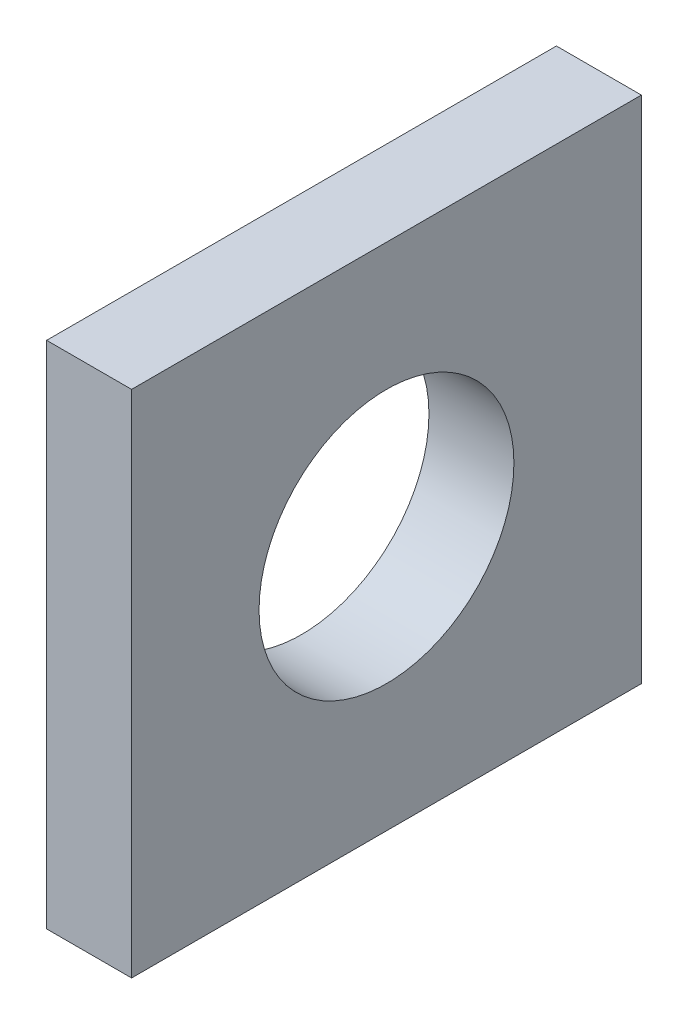
ISO-10303-21;
HEADER;
FILE_DESCRIPTION(('STEP AP214'),'2;1');
FILE_NAME('part.step','',(''),(''),'','','');
FILE_SCHEMA(('AUTOMOTIVE_DESIGN { 1 0 10303 214 1 1 1 1 }'));
ENDSEC;
DATA;
#1=APPLICATION_CONTEXT('core data for automotive mechanical design processes');
#2=APPLICATION_PROTOCOL_DEFINITION('international standard','automotive_design',2000,#1);
#3=PRODUCT_CONTEXT('',#1,'mechanical');
#4=PRODUCT('Part','Part','',(#3));
#5=PRODUCT_RELATED_PRODUCT_CATEGORY('part','',(#4));
#6=PRODUCT_DEFINITION_FORMATION('','',#4);
#7=PRODUCT_DEFINITION_CONTEXT('part definition',#1,'design');
#8=PRODUCT_DEFINITION('design','',#6,#7);
#9=PRODUCT_DEFINITION_SHAPE('','',#8);
#10=(LENGTH_UNIT() NAMED_UNIT(*) SI_UNIT(.MILLI.,.METRE.));
#11=(NAMED_UNIT(*) PLANE_ANGLE_UNIT() SI_UNIT($,.RADIAN.));
#12=(NAMED_UNIT(*) SI_UNIT($,.STERADIAN.) SOLID_ANGLE_UNIT());
#13=UNCERTAINTY_MEASURE_WITH_UNIT(LENGTH_MEASURE(1.E-05),#10,'distance_accuracy_value','');
#14=(GEOMETRIC_REPRESENTATION_CONTEXT(3) GLOBAL_UNCERTAINTY_ASSIGNED_CONTEXT((#13)) GLOBAL_UNIT_ASSIGNED_CONTEXT((#10,
#11,#12)) REPRESENTATION_CONTEXT('',''));
#15=CARTESIAN_POINT('',(0.,0.,0.));
#16=DIRECTION('',(0.,0.,1.));
#17=DIRECTION('',(1.,0.,0.));
#18=AXIS2_PLACEMENT_3D('',#15,#16,#17);
#19=CARTESIAN_POINT('',(3.175,0.,0.));
#20=DIRECTION('',(-1.,0.,0.));
#21=DIRECTION('',(0.,0.,1.));
#22=AXIS2_PLACEMENT_3D('',#19,#20,#21);
#23=PLANE('',#22);
#24=DIRECTION('',(0.,1.,0.));
#25=VECTOR('',#24,1.);
#26=CARTESIAN_POINT('',(3.175,-9.525,-9.525));
#27=LINE('',#26,#25);
#28=CARTESIAN_POINT('',(3.175,-9.525,-9.525));
#29=VERTEX_POINT('',#28);
#30=CARTESIAN_POINT('',(3.175,9.525,-9.525));
#31=VERTEX_POINT('',#30);
#32=EDGE_CURVE('E92',#29,#31,#27,.T.);
#33=ORIENTED_EDGE('',*,*,#32,.T.);
#34=DIRECTION('',(0.,0.,1.));
#35=VECTOR('',#34,1.);
#36=CARTESIAN_POINT('',(3.175,9.525,9.525));
#37=LINE('',#36,#35);
#38=CARTESIAN_POINT('',(3.175,9.525,9.525));
#39=VERTEX_POINT('',#38);
#40=EDGE_CURVE('E87',#31,#39,#37,.T.);
#41=ORIENTED_EDGE('',*,*,#40,.T.);
#42=DIRECTION('',(0.,-1.,0.));
#43=VECTOR('',#42,1.);
#44=CARTESIAN_POINT('',(3.175,-9.525,9.525));
#45=LINE('',#44,#43);
#46=CARTESIAN_POINT('',(3.175,-9.525,9.525));
#47=VERTEX_POINT('',#46);
#48=EDGE_CURVE('E90',#39,#47,#45,.T.);
#49=ORIENTED_EDGE('',*,*,#48,.T.);
#50=DIRECTION('',(0.,0.,-1.));
#51=VECTOR('',#50,1.);
#52=CARTESIAN_POINT('',(3.175,-9.525,9.525));
#53=LINE('',#52,#51);
#54=EDGE_CURVE('E57',#47,#29,#53,.T.);
#55=ORIENTED_EDGE('',*,*,#54,.T.);
#56=EDGE_LOOP('',(#33,#41,#49,#55));
#57=FACE_BOUND('',#56,.T.);
#58=CARTESIAN_POINT('',(3.175,0.,0.));
#59=DIRECTION('',(1.,0.,0.));
#60=DIRECTION('',(0.,0.,-1.));
#61=AXIS2_PLACEMENT_3D('',#58,#59,#60);
#62=CIRCLE('',#61,4.7625);
#63=CARTESIAN_POINT('',(3.175,0.,-4.7625));
#64=VERTEX_POINT('',#63);
#65=EDGE_CURVE('E112',#64,#64,#62,.T.);
#66=ORIENTED_EDGE('',*,*,#65,.F.);
#67=EDGE_LOOP('',(#66));
#68=FACE_BOUND('',#67,.T.);
#69=ADVANCED_FACE('F39',(#57,#68),#23,.F.);
#70=CARTESIAN_POINT('',(0.,0.,0.));
#71=DIRECTION('',(-1.,0.,0.));
#72=DIRECTION('',(0.,0.,1.));
#73=AXIS2_PLACEMENT_3D('',#70,#71,#72);
#74=PLANE('',#73);
#75=DIRECTION('',(0.,1.,0.));
#76=VECTOR('',#75,1.);
#77=CARTESIAN_POINT('',(0.,-9.525,-9.525));
#78=LINE('',#77,#76);
#79=CARTESIAN_POINT('',(0.,-9.525,-9.525));
#80=VERTEX_POINT('',#79);
#81=CARTESIAN_POINT('',(0.,9.525,-9.525));
#82=VERTEX_POINT('',#81);
#83=EDGE_CURVE('E108',#80,#82,#78,.T.);
#84=ORIENTED_EDGE('',*,*,#83,.F.);
#85=DIRECTION('',(0.,0.,-1.));
#86=VECTOR('',#85,1.);
#87=CARTESIAN_POINT('',(0.,-9.525,9.525));
#88=LINE('',#87,#86);
#89=CARTESIAN_POINT('',(0.,-9.525,9.525));
#90=VERTEX_POINT('',#89);
#91=EDGE_CURVE('E80',#90,#80,#88,.T.);
#92=ORIENTED_EDGE('',*,*,#91,.F.);
#93=DIRECTION('',(0.,-1.,0.));
#94=VECTOR('',#93,1.);
#95=CARTESIAN_POINT('',(0.,-9.525,9.525));
#96=LINE('',#95,#94);
#97=CARTESIAN_POINT('',(0.,9.525,9.525));
#98=VERTEX_POINT('',#97);
#99=EDGE_CURVE('E74',#98,#90,#96,.T.);
#100=ORIENTED_EDGE('',*,*,#99,.F.);
#101=DIRECTION('',(0.,0.,1.));
#102=VECTOR('',#101,1.);
#103=CARTESIAN_POINT('',(0.,9.525,9.525));
#104=LINE('',#103,#102);
#105=EDGE_CURVE('E97',#82,#98,#104,.T.);
#106=ORIENTED_EDGE('',*,*,#105,.F.);
#107=EDGE_LOOP('',(#84,#92,#100,#106));
#108=FACE_BOUND('',#107,.T.);
#109=CARTESIAN_POINT('',(0.,0.,0.));
#110=DIRECTION('',(1.,0.,0.));
#111=DIRECTION('',(0.,0.,-1.));
#112=AXIS2_PLACEMENT_3D('',#109,#110,#111);
#113=CIRCLE('',#112,4.7625);
#114=CARTESIAN_POINT('',(0.,0.,-4.7625));
#115=VERTEX_POINT('',#114);
#116=EDGE_CURVE('E130',#115,#115,#113,.T.);
#117=ORIENTED_EDGE('',*,*,#116,.T.);
#118=EDGE_LOOP('',(#117));
#119=FACE_BOUND('',#118,.T.);
#120=ADVANCED_FACE('F125',(#108,#119),#74,.T.);
#121=CARTESIAN_POINT('',(3.175,-9.525,-9.525));
#122=DIRECTION('',(0.,0.,1.));
#123=DIRECTION('',(1.,0.,0.));
#124=AXIS2_PLACEMENT_3D('',#121,#122,#123);
#125=PLANE('',#124);
#126=ORIENTED_EDGE('',*,*,#83,.T.);
#127=DIRECTION('',(-1.,0.,0.));
#128=VECTOR('',#127,1.);
#129=CARTESIAN_POINT('',(3.175,9.525,-9.525));
#130=LINE('',#129,#128);
#131=EDGE_CURVE('E11',#31,#82,#130,.T.);
#132=ORIENTED_EDGE('',*,*,#131,.F.);
#133=ORIENTED_EDGE('',*,*,#32,.F.);
#134=DIRECTION('',(-1.,0.,0.));
#135=VECTOR('',#134,1.);
#136=CARTESIAN_POINT('',(3.175,-9.525,-9.525));
#137=LINE('',#136,#135);
#138=EDGE_CURVE('E104',#29,#80,#137,.T.);
#139=ORIENTED_EDGE('',*,*,#138,.T.);
#140=EDGE_LOOP('',(#126,#132,#133,#139));
#141=FACE_BOUND('',#140,.T.);
#142=ADVANCED_FACE('F41',(#141),#125,.F.);
#143=CARTESIAN_POINT('',(3.175,9.525,9.525));
#144=DIRECTION('',(0.,-1.,0.));
#145=DIRECTION('',(0.,0.,-1.));
#146=AXIS2_PLACEMENT_3D('',#143,#144,#145);
#147=PLANE('',#146);
#148=ORIENTED_EDGE('',*,*,#105,.T.);
#149=DIRECTION('',(-1.,0.,0.));
#150=VECTOR('',#149,1.);
#151=CARTESIAN_POINT('',(3.175,9.525,9.525));
#152=LINE('',#151,#150);
#153=EDGE_CURVE('E49',#39,#98,#152,.T.);
#154=ORIENTED_EDGE('',*,*,#153,.F.);
#155=ORIENTED_EDGE('',*,*,#40,.F.);
#156=ORIENTED_EDGE('',*,*,#131,.T.);
#157=EDGE_LOOP('',(#148,#154,#155,#156));
#158=FACE_BOUND('',#157,.T.);
#159=ADVANCED_FACE('F96',(#158),#147,.F.);
#160=CARTESIAN_POINT('',(3.175,-9.525,9.525));
#161=DIRECTION('',(0.,0.,-1.));
#162=DIRECTION('',(-1.,0.,0.));
#163=AXIS2_PLACEMENT_3D('',#160,#161,#162);
#164=PLANE('',#163);
#165=ORIENTED_EDGE('',*,*,#99,.T.);
#166=DIRECTION('',(-1.,0.,0.));
#167=VECTOR('',#166,1.);
#168=CARTESIAN_POINT('',(3.175,-9.525,9.525));
#169=LINE('',#168,#167);
#170=EDGE_CURVE('E99',#47,#90,#169,.T.);
#171=ORIENTED_EDGE('',*,*,#170,.F.);
#172=ORIENTED_EDGE('',*,*,#48,.F.);
#173=ORIENTED_EDGE('',*,*,#153,.T.);
#174=EDGE_LOOP('',(#165,#171,#172,#173));
#175=FACE_BOUND('',#174,.T.);
#176=ADVANCED_FACE('F100',(#175),#164,.F.);
#177=CARTESIAN_POINT('',(3.175,-9.525,9.525));
#178=DIRECTION('',(0.,1.,0.));
#179=DIRECTION('',(0.,0.,1.));
#180=AXIS2_PLACEMENT_3D('',#177,#178,#179);
#181=PLANE('',#180);
#182=ORIENTED_EDGE('',*,*,#91,.T.);
#183=ORIENTED_EDGE('',*,*,#138,.F.);
#184=ORIENTED_EDGE('',*,*,#54,.F.);
#185=ORIENTED_EDGE('',*,*,#170,.T.);
#186=EDGE_LOOP('',(#182,#183,#184,#185));
#187=FACE_BOUND('',#186,.T.);
#188=ADVANCED_FACE('F122',(#187),#181,.F.);
#189=CARTESIAN_POINT('',(3.175,0.,0.));
#190=DIRECTION('',(-1.,0.,0.));
#191=DIRECTION('',(0.,0.,1.));
#192=AXIS2_PLACEMENT_3D('',#189,#190,#191);
#193=CYLINDRICAL_SURFACE('',#192,4.7625);
#194=ORIENTED_EDGE('',*,*,#65,.T.);
#195=EDGE_LOOP('',(#194));
#196=FACE_BOUND('',#195,.T.);
#197=ORIENTED_EDGE('',*,*,#116,.F.);
#198=EDGE_LOOP('',(#197));
#199=FACE_BOUND('',#198,.T.);
#200=ADVANCED_FACE('F138',(#196,#199),#193,.F.);
#201=CLOSED_SHELL('',(#69,#120,#142,#159,#176,#188,#200));
#202=MANIFOLD_SOLID_BREP('B2',#201);
#203=ADVANCED_BREP_SHAPE_REPRESENTATION('',(#18,#202),#14);
#204=SHAPE_DEFINITION_REPRESENTATION(#9,#203);
ENDSEC;
END-ISO-10303-21;
